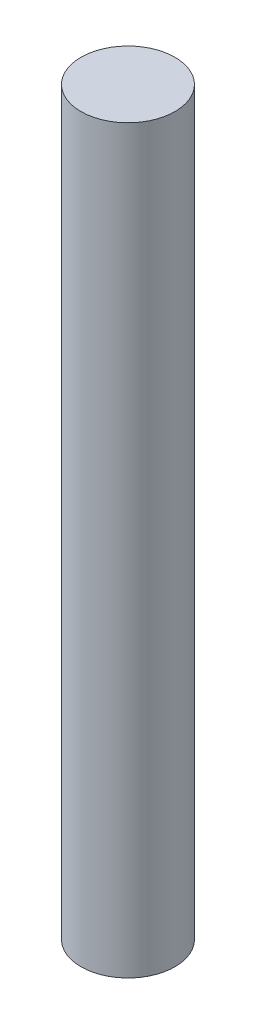
ISO-10303-21;
HEADER;
FILE_DESCRIPTION(('STEP AP214'),'2;1');
FILE_NAME('part.step','',(''),(''),'','','');
FILE_SCHEMA(('AUTOMOTIVE_DESIGN { 1 0 10303 214 1 1 1 1 }'));
ENDSEC;
DATA;
#1=APPLICATION_CONTEXT('core data for automotive mechanical design processes');
#2=APPLICATION_PROTOCOL_DEFINITION('international standard','automotive_design',2000,#1);
#3=PRODUCT_CONTEXT('',#1,'mechanical');
#4=PRODUCT('Part','Part','',(#3));
#5=PRODUCT_RELATED_PRODUCT_CATEGORY('part','',(#4));
#6=PRODUCT_DEFINITION_FORMATION('','',#4);
#7=PRODUCT_DEFINITION_CONTEXT('part definition',#1,'design');
#8=PRODUCT_DEFINITION('design','',#6,#7);
#9=PRODUCT_DEFINITION_SHAPE('','',#8);
#10=(LENGTH_UNIT() NAMED_UNIT(*) SI_UNIT(.MILLI.,.METRE.));
#11=(NAMED_UNIT(*) PLANE_ANGLE_UNIT() SI_UNIT($,.RADIAN.));
#12=(NAMED_UNIT(*) SI_UNIT($,.STERADIAN.) SOLID_ANGLE_UNIT());
#13=UNCERTAINTY_MEASURE_WITH_UNIT(LENGTH_MEASURE(1.E-05),#10,'distance_accuracy_value','');
#14=(GEOMETRIC_REPRESENTATION_CONTEXT(3) GLOBAL_UNCERTAINTY_ASSIGNED_CONTEXT((#13)) GLOBAL_UNIT_ASSIGNED_CONTEXT((#10,
#11,#12)) REPRESENTATION_CONTEXT('',''));
#15=CARTESIAN_POINT('',(0.,0.,0.));
#16=DIRECTION('',(0.,0.,1.));
#17=DIRECTION('',(1.,0.,0.));
#18=AXIS2_PLACEMENT_3D('',#15,#16,#17);
#19=CARTESIAN_POINT('',(0.,50.,0.));
#20=DIRECTION('',(0.,-1.,0.));
#21=DIRECTION('',(0.,0.,-1.));
#22=AXIS2_PLACEMENT_3D('',#19,#20,#21);
#23=CYLINDRICAL_SURFACE('',#22,3.175);
#24=CARTESIAN_POINT('',(0.,50.,0.));
#25=DIRECTION('',(0.,1.,0.));
#26=DIRECTION('',(0.,0.,1.));
#27=AXIS2_PLACEMENT_3D('',#24,#25,#26);
#28=CIRCLE('',#27,3.175);
#29=CARTESIAN_POINT('',(0.,50.,3.175));
#30=VERTEX_POINT('',#29);
#31=EDGE_CURVE('E10',#30,#30,#28,.T.);
#32=ORIENTED_EDGE('',*,*,#31,.F.);
#33=EDGE_LOOP('',(#32));
#34=FACE_BOUND('',#33,.T.);
#35=CARTESIAN_POINT('',(0.,0.,0.));
#36=DIRECTION('',(0.,1.,0.));
#37=DIRECTION('',(0.,0.,1.));
#38=AXIS2_PLACEMENT_3D('',#35,#36,#37);
#39=CIRCLE('',#38,3.175);
#40=CARTESIAN_POINT('',(0.,0.,3.175));
#41=VERTEX_POINT('',#40);
#42=EDGE_CURVE('E42',#41,#41,#39,.T.);
#43=ORIENTED_EDGE('',*,*,#42,.T.);
#44=EDGE_LOOP('',(#43));
#45=FACE_BOUND('',#44,.T.);
#46=ADVANCED_FACE('F39',(#34,#45),#23,.T.);
#47=CARTESIAN_POINT('',(0.,50.,0.));
#48=DIRECTION('',(0.,1.,0.));
#49=DIRECTION('',(0.,0.,1.));
#50=AXIS2_PLACEMENT_3D('',#47,#48,#49);
#51=PLANE('',#50);
#52=ORIENTED_EDGE('',*,*,#31,.T.);
#53=EDGE_LOOP('',(#52));
#54=FACE_BOUND('',#53,.T.);
#55=ADVANCED_FACE('F54',(#54),#51,.T.);
#56=CARTESIAN_POINT('',(0.,0.,0.));
#57=DIRECTION('',(0.,1.,0.));
#58=DIRECTION('',(0.,0.,1.));
#59=AXIS2_PLACEMENT_3D('',#56,#57,#58);
#60=PLANE('',#59);
#61=ORIENTED_EDGE('',*,*,#42,.F.);
#62=EDGE_LOOP('',(#61));
#63=FACE_BOUND('',#62,.T.);
#64=ADVANCED_FACE('F52',(#63),#60,.F.);
#65=CLOSED_SHELL('',(#46,#55,#64));
#66=MANIFOLD_SOLID_BREP('B2',#65);
#67=ADVANCED_BREP_SHAPE_REPRESENTATION('',(#18,#66),#14);
#68=SHAPE_DEFINITION_REPRESENTATION(#9,#67);
ENDSEC;
END-ISO-10303-21;
